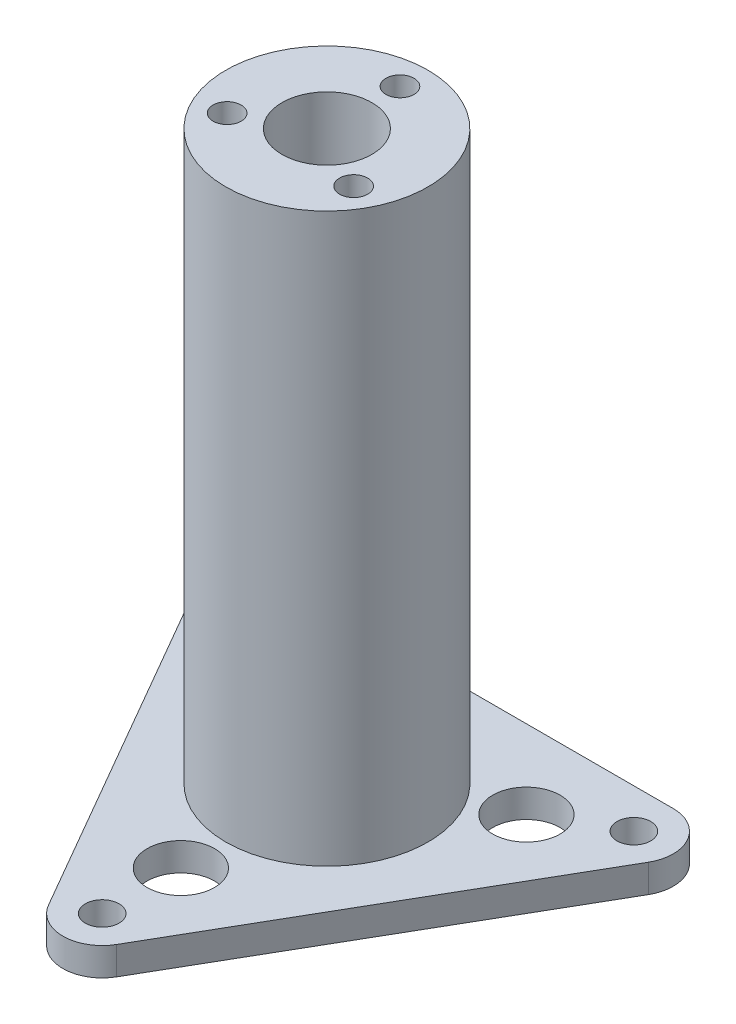
ISO-10303-21;
HEADER;
FILE_DESCRIPTION(('STEP AP214'),'2;1');
FILE_NAME('part.step','',(''),(''),'','','');
FILE_SCHEMA(('AUTOMOTIVE_DESIGN { 1 0 10303 214 1 1 1 1 }'));
ENDSEC;
DATA;
#1=APPLICATION_CONTEXT('core data for automotive mechanical design processes');
#2=APPLICATION_PROTOCOL_DEFINITION('international standard','automotive_design',2000,#1);
#3=PRODUCT_CONTEXT('',#1,'mechanical');
#4=PRODUCT('Part','Part','',(#3));
#5=PRODUCT_RELATED_PRODUCT_CATEGORY('part','',(#4));
#6=PRODUCT_DEFINITION_FORMATION('','',#4);
#7=PRODUCT_DEFINITION_CONTEXT('part definition',#1,'design');
#8=PRODUCT_DEFINITION('design','',#6,#7);
#9=PRODUCT_DEFINITION_SHAPE('','',#8);
#10=(LENGTH_UNIT() NAMED_UNIT(*) SI_UNIT(.MILLI.,.METRE.));
#11=(NAMED_UNIT(*) PLANE_ANGLE_UNIT() SI_UNIT($,.RADIAN.));
#12=(NAMED_UNIT(*) SI_UNIT($,.STERADIAN.) SOLID_ANGLE_UNIT());
#13=UNCERTAINTY_MEASURE_WITH_UNIT(LENGTH_MEASURE(1.E-05),#10,'distance_accuracy_value','');
#14=(GEOMETRIC_REPRESENTATION_CONTEXT(3) GLOBAL_UNCERTAINTY_ASSIGNED_CONTEXT((#13)) GLOBAL_UNIT_ASSIGNED_CONTEXT((#10,
#11,#12)) REPRESENTATION_CONTEXT('',''));
#15=CARTESIAN_POINT('',(0.,0.,0.));
#16=DIRECTION('',(0.,0.,1.));
#17=DIRECTION('',(1.,0.,0.));
#18=AXIS2_PLACEMENT_3D('',#15,#16,#17);
#19=CARTESIAN_POINT('',(0.,0.,0.));
#20=DIRECTION('',(0.,1.,0.));
#21=DIRECTION('',(0.,0.,1.));
#22=AXIS2_PLACEMENT_3D('',#19,#20,#21);
#23=CYLINDRICAL_SURFACE('',#22,4.00000000000001);
#24=CARTESIAN_POINT('',(0.,53.,0.));
#25=DIRECTION('',(0.,1.,0.));
#26=DIRECTION('',(0.,0.,1.));
#27=AXIS2_PLACEMENT_3D('',#24,#25,#26);
#28=CIRCLE('',#27,4.00000000000001);
#29=CARTESIAN_POINT('',(0.,53.,4.00000000000001));
#30=VERTEX_POINT('',#29);
#31=EDGE_CURVE('E126',#30,#30,#28,.T.);
#32=ORIENTED_EDGE('',*,*,#31,.T.);
#33=EDGE_LOOP('',(#32));
#34=FACE_BOUND('',#33,.T.);
#35=CARTESIAN_POINT('',(0.,40.,0.));
#36=DIRECTION('',(0.,-1.,0.));
#37=DIRECTION('',(0.,0.,-1.));
#38=AXIS2_PLACEMENT_3D('',#35,#36,#37);
#39=CIRCLE('',#38,4.00000000000001);
#40=CARTESIAN_POINT('',(0.,40.,-4.00000000000001));
#41=VERTEX_POINT('',#40);
#42=EDGE_CURVE('E257',#41,#41,#39,.F.);
#43=ORIENTED_EDGE('',*,*,#42,.F.);
#44=EDGE_LOOP('',(#43));
#45=FACE_BOUND('',#44,.T.);
#46=ADVANCED_FACE('F43',(#34,#45),#23,.F.);
#47=CARTESIAN_POINT('',(23.5,2.5,0.));
#48=DIRECTION('',(0.,1.,0.));
#49=DIRECTION('',(0.,0.,1.));
#50=AXIS2_PLACEMENT_3D('',#47,#48,#49);
#51=PLANE('',#50);
#52=CARTESIAN_POINT('',(11.2583302491977,2.5,-6.5));
#53=DIRECTION('',(0.,1.,0.));
#54=DIRECTION('',(0.,0.,1.));
#55=AXIS2_PLACEMENT_3D('',#52,#53,#54);
#56=CIRCLE('',#55,3.);
#57=CARTESIAN_POINT('',(11.2583302491977,2.5,-3.5));
#58=VERTEX_POINT('',#57);
#59=EDGE_CURVE('E210',#58,#58,#56,.T.);
#60=ORIENTED_EDGE('',*,*,#59,.F.);
#61=EDGE_LOOP('',(#60));
#62=FACE_BOUND('',#61,.T.);
#63=CARTESIAN_POINT('',(0.,2.5,13.));
#64=DIRECTION('',(0.,1.,0.));
#65=DIRECTION('',(0.,0.,1.));
#66=AXIS2_PLACEMENT_3D('',#63,#64,#65);
#67=CIRCLE('',#66,3.);
#68=CARTESIAN_POINT('',(0.,2.5,16.));
#69=VERTEX_POINT('',#68);
#70=EDGE_CURVE('E251',#69,#69,#67,.T.);
#71=ORIENTED_EDGE('',*,*,#70,.F.);
#72=EDGE_LOOP('',(#71));
#73=FACE_BOUND('',#72,.T.);
#74=CARTESIAN_POINT('',(-17.3205080756888,2.5,-10.));
#75=DIRECTION('',(0.,1.,0.));
#76=DIRECTION('',(0.,0.,1.));
#77=AXIS2_PLACEMENT_3D('',#74,#75,#76);
#78=CIRCLE('',#77,1.5);
#79=CARTESIAN_POINT('',(-17.3205080756888,2.5,-8.50000000000001));
#80=VERTEX_POINT('',#79);
#81=EDGE_CURVE('E247',#80,#80,#78,.T.);
#82=ORIENTED_EDGE('',*,*,#81,.F.);
#83=EDGE_LOOP('',(#82));
#84=FACE_BOUND('',#83,.T.);
#85=CARTESIAN_POINT('',(17.3205080756888,2.5,-10.));
#86=DIRECTION('',(0.,1.,0.));
#87=DIRECTION('',(0.,0.,1.));
#88=AXIS2_PLACEMENT_3D('',#85,#86,#87);
#89=CIRCLE('',#88,1.5);
#90=CARTESIAN_POINT('',(17.3205080756888,2.5,-8.49999999999999));
#91=VERTEX_POINT('',#90);
#92=EDGE_CURVE('E222',#91,#91,#89,.T.);
#93=ORIENTED_EDGE('',*,*,#92,.F.);
#94=EDGE_LOOP('',(#93));
#95=FACE_BOUND('',#94,.T.);
#96=CARTESIAN_POINT('',(-11.2583302491977,2.5,-6.50000000000001));
#97=DIRECTION('',(0.,1.,0.));
#98=DIRECTION('',(0.,0.,1.));
#99=AXIS2_PLACEMENT_3D('',#96,#97,#98);
#100=CIRCLE('',#99,3.);
#101=CARTESIAN_POINT('',(-11.2583302491977,2.5,-3.50000000000001));
#102=VERTEX_POINT('',#101);
#103=EDGE_CURVE('E218',#102,#102,#100,.T.);
#104=ORIENTED_EDGE('',*,*,#103,.F.);
#105=EDGE_LOOP('',(#104));
#106=FACE_BOUND('',#105,.T.);
#107=CARTESIAN_POINT('',(0.,2.5,20.));
#108=DIRECTION('',(0.,1.,0.));
#109=DIRECTION('',(0.,0.,1.));
#110=AXIS2_PLACEMENT_3D('',#107,#108,#109);
#111=CIRCLE('',#110,1.5);
#112=CARTESIAN_POINT('',(0.,2.5,21.5));
#113=VERTEX_POINT('',#112);
#114=EDGE_CURVE('E204',#113,#113,#111,.T.);
#115=ORIENTED_EDGE('',*,*,#114,.F.);
#116=EDGE_LOOP('',(#115));
#117=FACE_BOUND('',#116,.T.);
#118=CARTESIAN_POINT('',(0.,2.5,0.));
#119=DIRECTION('',(0.,-1.,0.));
#120=DIRECTION('',(0.,0.,-1.));
#121=AXIS2_PLACEMENT_3D('',#118,#119,#120);
#122=CIRCLE('',#121,9.00000000000001);
#123=CARTESIAN_POINT('',(0.,2.5,-9.00000000000001));
#124=VERTEX_POINT('',#123);
#125=EDGE_CURVE('E209',#124,#124,#122,.T.);
#126=ORIENTED_EDGE('',*,*,#125,.T.);
#127=EDGE_LOOP('',(#126));
#128=FACE_BOUND('',#127,.T.);
#129=DIRECTION('',(0.5,0.,0.866025403784439));
#130=VECTOR('',#129,1.);
#131=CARTESIAN_POINT('',(-5.81634295108992,2.5,16.9257984944671));
#132=LINE('',#131,#130);
#133=CARTESIAN_POINT('',(-20.3515969889343,2.5,-8.25000000000001));
#134=VERTEX_POINT('',#133);
#135=CARTESIAN_POINT('',(-3.03108891324553,2.5,21.75));
#136=VERTEX_POINT('',#135);
#137=EDGE_CURVE('E214',#134,#136,#132,.T.);
#138=ORIENTED_EDGE('',*,*,#137,.T.);
#139=CARTESIAN_POINT('',(0.,2.5,20.));
#140=DIRECTION('',(0.,1.,0.));
#141=DIRECTION('',(0.,0.,1.));
#142=AXIS2_PLACEMENT_3D('',#139,#140,#141);
#143=CIRCLE('',#142,3.49999999999999);
#144=CARTESIAN_POINT('',(3.03108891324552,2.5,21.75));
#145=VERTEX_POINT('',#144);
#146=EDGE_CURVE('E52',#136,#145,#143,.T.);
#147=ORIENTED_EDGE('',*,*,#146,.T.);
#148=DIRECTION('',(0.5,0.,-0.866025403784439));
#149=VECTOR('',#148,1.);
#150=CARTESIAN_POINT('',(17.5663429510899,2.5,-3.42579849446716));
#151=LINE('',#150,#149);
#152=CARTESIAN_POINT('',(20.3515969889343,2.5,-8.25));
#153=VERTEX_POINT('',#152);
#154=EDGE_CURVE('E238',#145,#153,#151,.T.);
#155=ORIENTED_EDGE('',*,*,#154,.T.);
#156=CARTESIAN_POINT('',(17.3205080756888,2.5,-9.99999999999999));
#157=DIRECTION('',(0.,1.,0.));
#158=DIRECTION('',(0.,0.,1.));
#159=AXIS2_PLACEMENT_3D('',#156,#157,#158);
#160=CIRCLE('',#159,3.49999999999999);
#161=CARTESIAN_POINT('',(17.3205080756888,2.5,-13.5));
#162=VERTEX_POINT('',#161);
#163=EDGE_CURVE('E234',#153,#162,#160,.T.);
#164=ORIENTED_EDGE('',*,*,#163,.T.);
#165=DIRECTION('',(-1.,0.,0.));
#166=VECTOR('',#165,1.);
#167=CARTESIAN_POINT('',(23.5,2.5,-13.5));
#168=LINE('',#167,#166);
#169=CARTESIAN_POINT('',(-17.3205080756888,2.5,-13.5));
#170=VERTEX_POINT('',#169);
#171=EDGE_CURVE('E230',#162,#170,#168,.T.);
#172=ORIENTED_EDGE('',*,*,#171,.T.);
#173=CARTESIAN_POINT('',(-17.3205080756888,2.5,-10.));
#174=DIRECTION('',(0.,1.,0.));
#175=DIRECTION('',(0.,0.,1.));
#176=AXIS2_PLACEMENT_3D('',#173,#174,#175);
#177=CIRCLE('',#176,3.49999999999999);
#178=EDGE_CURVE('E226',#170,#134,#177,.T.);
#179=ORIENTED_EDGE('',*,*,#178,.T.);
#180=EDGE_LOOP('',(#138,#147,#155,#164,#172,#179));
#181=FACE_BOUND('',#180,.T.);
#182=ADVANCED_FACE('F306',(#62,#73,#84,#95,#106,#117,#128,#181),#51,.T.);
#183=CARTESIAN_POINT('',(0.,0.,0.));
#184=DIRECTION('',(0.,-1.,0.));
#185=DIRECTION('',(0.,0.,-1.));
#186=AXIS2_PLACEMENT_3D('',#183,#184,#185);
#187=CYLINDRICAL_SURFACE('',#186,9.00000000000001);
#188=CARTESIAN_POINT('',(0.,53.,0.));
#189=DIRECTION('',(0.,-1.,0.));
#190=DIRECTION('',(0.,0.,-1.));
#191=AXIS2_PLACEMENT_3D('',#188,#189,#190);
#192=CIRCLE('',#191,9.00000000000001);
#193=CARTESIAN_POINT('',(0.,53.,-9.00000000000001));
#194=VERTEX_POINT('',#193);
#195=EDGE_CURVE('E205',#194,#194,#192,.T.);
#196=ORIENTED_EDGE('',*,*,#195,.T.);
#197=EDGE_LOOP('',(#196));
#198=FACE_BOUND('',#197,.T.);
#199=ORIENTED_EDGE('',*,*,#125,.F.);
#200=EDGE_LOOP('',(#199));
#201=FACE_BOUND('',#200,.T.);
#202=ADVANCED_FACE('F327',(#198,#201),#187,.T.);
#203=CARTESIAN_POINT('',(9.00000000000001,53.,0.));
#204=DIRECTION('',(0.,1.,0.));
#205=DIRECTION('',(0.,0.,1.));
#206=AXIS2_PLACEMENT_3D('',#203,#204,#205);
#207=PLANE('',#206);
#208=ORIENTED_EDGE('',*,*,#31,.F.);
#209=EDGE_LOOP('',(#208));
#210=FACE_BOUND('',#209,.T.);
#211=CARTESIAN_POINT('',(0.,53.,-6.50000000000001));
#212=DIRECTION('',(0.,1.,0.));
#213=DIRECTION('',(0.,0.,1.));
#214=AXIS2_PLACEMENT_3D('',#211,#212,#213);
#215=CIRCLE('',#214,1.24999999999999);
#216=CARTESIAN_POINT('',(0.,53.,-5.25000000000002));
#217=VERTEX_POINT('',#216);
#218=EDGE_CURVE('E118',#217,#217,#215,.T.);
#219=ORIENTED_EDGE('',*,*,#218,.F.);
#220=EDGE_LOOP('',(#219));
#221=FACE_BOUND('',#220,.T.);
#222=CARTESIAN_POINT('',(5.62916512459886,53.,3.25));
#223=DIRECTION('',(0.,1.,0.));
#224=DIRECTION('',(0.,0.,1.));
#225=AXIS2_PLACEMENT_3D('',#222,#223,#224);
#226=CIRCLE('',#225,1.24999999999999);
#227=CARTESIAN_POINT('',(5.62916512459886,53.,4.49999999999999));
#228=VERTEX_POINT('',#227);
#229=EDGE_CURVE('E117',#228,#228,#226,.T.);
#230=ORIENTED_EDGE('',*,*,#229,.F.);
#231=EDGE_LOOP('',(#230));
#232=FACE_BOUND('',#231,.T.);
#233=CARTESIAN_POINT('',(-5.62916512459886,53.,3.25));
#234=DIRECTION('',(0.,1.,0.));
#235=DIRECTION('',(0.,0.,1.));
#236=AXIS2_PLACEMENT_3D('',#233,#234,#235);
#237=CIRCLE('',#236,1.24999999999999);
#238=CARTESIAN_POINT('',(-5.62916512459886,53.,4.49999999999999));
#239=VERTEX_POINT('',#238);
#240=EDGE_CURVE('E133',#239,#239,#237,.T.);
#241=ORIENTED_EDGE('',*,*,#240,.F.);
#242=EDGE_LOOP('',(#241));
#243=FACE_BOUND('',#242,.T.);
#244=ORIENTED_EDGE('',*,*,#195,.F.);
#245=EDGE_LOOP('',(#244));
#246=FACE_BOUND('',#245,.T.);
#247=ADVANCED_FACE('F378',(#210,#221,#232,#243,#246),#207,.T.);
#248=CARTESIAN_POINT('',(0.,53.,20.));
#249=DIRECTION('',(0.,-1.,0.));
#250=DIRECTION('',(0.,0.,-1.));
#251=AXIS2_PLACEMENT_3D('',#248,#249,#250);
#252=CYLINDRICAL_SURFACE('',#251,1.5);
#253=ORIENTED_EDGE('',*,*,#114,.T.);
#254=EDGE_LOOP('',(#253));
#255=FACE_BOUND('',#254,.T.);
#256=CARTESIAN_POINT('',(0.,0.,20.));
#257=DIRECTION('',(0.,-1.,0.));
#258=DIRECTION('',(0.,0.,-1.));
#259=AXIS2_PLACEMENT_3D('',#256,#257,#258);
#260=CIRCLE('',#259,1.5);
#261=CARTESIAN_POINT('',(0.,0.,18.5));
#262=VERTEX_POINT('',#261);
#263=EDGE_CURVE('E197',#262,#262,#260,.T.);
#264=ORIENTED_EDGE('',*,*,#263,.T.);
#265=EDGE_LOOP('',(#264));
#266=FACE_BOUND('',#265,.T.);
#267=ADVANCED_FACE('F358',(#255,#266),#252,.F.);
#268=CARTESIAN_POINT('',(-11.2583302491977,53.,-6.50000000000001));
#269=DIRECTION('',(0.,-1.,0.));
#270=DIRECTION('',(0.,0.,-1.));
#271=AXIS2_PLACEMENT_3D('',#268,#269,#270);
#272=CYLINDRICAL_SURFACE('',#271,3.);
#273=ORIENTED_EDGE('',*,*,#103,.T.);
#274=EDGE_LOOP('',(#273));
#275=FACE_BOUND('',#274,.T.);
#276=CARTESIAN_POINT('',(-11.2583302491977,0.,-6.50000000000001));
#277=DIRECTION('',(0.,-1.,0.));
#278=DIRECTION('',(0.,0.,-1.));
#279=AXIS2_PLACEMENT_3D('',#276,#277,#278);
#280=CIRCLE('',#279,3.);
#281=CARTESIAN_POINT('',(-11.2583302491977,0.,-9.50000000000001));
#282=VERTEX_POINT('',#281);
#283=EDGE_CURVE('E165',#282,#282,#280,.T.);
#284=ORIENTED_EDGE('',*,*,#283,.T.);
#285=EDGE_LOOP('',(#284));
#286=FACE_BOUND('',#285,.T.);
#287=ADVANCED_FACE('F353',(#275,#286),#272,.F.);
#288=CARTESIAN_POINT('',(0.,53.,20.));
#289=DIRECTION('',(0.,-1.,0.));
#290=DIRECTION('',(0.,0.,-1.));
#291=AXIS2_PLACEMENT_3D('',#288,#289,#290);
#292=CYLINDRICAL_SURFACE('',#291,3.49999999999999);
#293=ORIENTED_EDGE('',*,*,#146,.F.);
#294=DIRECTION('',(0.,-1.,0.));
#295=VECTOR('',#294,1.);
#296=CARTESIAN_POINT('',(-3.03108891324553,53.,21.75));
#297=LINE('',#296,#295);
#298=CARTESIAN_POINT('',(-3.03108891324552,0.,21.75));
#299=VERTEX_POINT('',#298);
#300=EDGE_CURVE('E161',#136,#299,#297,.T.);
#301=ORIENTED_EDGE('',*,*,#300,.T.);
#302=CARTESIAN_POINT('',(0.,0.,20.));
#303=DIRECTION('',(0.,-1.,0.));
#304=DIRECTION('',(0.,0.,-1.));
#305=AXIS2_PLACEMENT_3D('',#302,#303,#304);
#306=CIRCLE('',#305,3.49999999999999);
#307=CARTESIAN_POINT('',(3.03108891324552,0.,21.75));
#308=VERTEX_POINT('',#307);
#309=EDGE_CURVE('E141',#308,#299,#306,.T.);
#310=ORIENTED_EDGE('',*,*,#309,.F.);
#311=DIRECTION('',(0.,-1.,0.));
#312=VECTOR('',#311,1.);
#313=CARTESIAN_POINT('',(3.03108891324552,53.,21.75));
#314=LINE('',#313,#312);
#315=EDGE_CURVE('E162',#145,#308,#314,.T.);
#316=ORIENTED_EDGE('',*,*,#315,.F.);
#317=EDGE_LOOP('',(#293,#301,#310,#316));
#318=FACE_BOUND('',#317,.T.);
#319=ADVANCED_FACE('F299',(#318),#292,.T.);
#320=CARTESIAN_POINT('',(17.3205080756888,53.,-9.99999999999999));
#321=DIRECTION('',(0.,-1.,0.));
#322=DIRECTION('',(0.,0.,-1.));
#323=AXIS2_PLACEMENT_3D('',#320,#321,#322);
#324=CYLINDRICAL_SURFACE('',#323,3.49999999999999);
#325=ORIENTED_EDGE('',*,*,#163,.F.);
#326=DIRECTION('',(0.,-1.,0.));
#327=VECTOR('',#326,1.);
#328=CARTESIAN_POINT('',(20.3515969889343,53.,-8.25));
#329=LINE('',#328,#327);
#330=CARTESIAN_POINT('',(20.3515969889343,0.,-8.25));
#331=VERTEX_POINT('',#330);
#332=EDGE_CURVE('E166',#153,#331,#329,.T.);
#333=ORIENTED_EDGE('',*,*,#332,.T.);
#334=CARTESIAN_POINT('',(17.3205080756888,0.,-9.99999999999999));
#335=DIRECTION('',(0.,-1.,0.));
#336=DIRECTION('',(0.,0.,-1.));
#337=AXIS2_PLACEMENT_3D('',#334,#335,#336);
#338=CIRCLE('',#337,3.49999999999999);
#339=CARTESIAN_POINT('',(17.3205080756888,0.,-13.5));
#340=VERTEX_POINT('',#339);
#341=EDGE_CURVE('E154',#340,#331,#338,.T.);
#342=ORIENTED_EDGE('',*,*,#341,.F.);
#343=DIRECTION('',(0.,-1.,0.));
#344=VECTOR('',#343,1.);
#345=CARTESIAN_POINT('',(17.3205080756888,53.,-13.5));
#346=LINE('',#345,#344);
#347=EDGE_CURVE('E170',#162,#340,#346,.T.);
#348=ORIENTED_EDGE('',*,*,#347,.F.);
#349=EDGE_LOOP('',(#325,#333,#342,#348));
#350=FACE_BOUND('',#349,.T.);
#351=ADVANCED_FACE('F295',(#350),#324,.T.);
#352=CARTESIAN_POINT('',(-17.3205080756888,53.,-10.));
#353=DIRECTION('',(0.,-1.,0.));
#354=DIRECTION('',(0.,0.,-1.));
#355=AXIS2_PLACEMENT_3D('',#352,#353,#354);
#356=CYLINDRICAL_SURFACE('',#355,3.49999999999999);
#357=ORIENTED_EDGE('',*,*,#178,.F.);
#358=DIRECTION('',(0.,-1.,0.));
#359=VECTOR('',#358,1.);
#360=CARTESIAN_POINT('',(-17.3205080756888,53.,-13.5));
#361=LINE('',#360,#359);
#362=CARTESIAN_POINT('',(-17.3205080756888,0.,-13.5));
#363=VERTEX_POINT('',#362);
#364=EDGE_CURVE('E173',#170,#363,#361,.T.);
#365=ORIENTED_EDGE('',*,*,#364,.T.);
#366=CARTESIAN_POINT('',(-17.3205080756888,0.,-10.));
#367=DIRECTION('',(0.,-1.,0.));
#368=DIRECTION('',(0.,0.,-1.));
#369=AXIS2_PLACEMENT_3D('',#366,#367,#368);
#370=CIRCLE('',#369,3.49999999999999);
#371=CARTESIAN_POINT('',(-20.3515969889343,0.,-8.25000000000001));
#372=VERTEX_POINT('',#371);
#373=EDGE_CURVE('E59',#372,#363,#370,.T.);
#374=ORIENTED_EDGE('',*,*,#373,.F.);
#375=DIRECTION('',(0.,-1.,0.));
#376=VECTOR('',#375,1.);
#377=CARTESIAN_POINT('',(-20.3515969889343,53.,-8.25000000000001));
#378=LINE('',#377,#376);
#379=EDGE_CURVE('E176',#134,#372,#378,.T.);
#380=ORIENTED_EDGE('',*,*,#379,.F.);
#381=EDGE_LOOP('',(#357,#365,#374,#380));
#382=FACE_BOUND('',#381,.T.);
#383=ADVANCED_FACE('F303',(#382),#356,.T.);
#384=CARTESIAN_POINT('',(20.3515969889343,53.,-8.25000000000001));
#385=DIRECTION('',(0.866025403784438,0.,0.5));
#386=DIRECTION('',(0.5,0.,-0.866025403784439));
#387=AXIS2_PLACEMENT_3D('',#384,#385,#386);
#388=PLANE('',#387);
#389=ORIENTED_EDGE('',*,*,#315,.T.);
#390=DIRECTION('',(-0.5,0.,0.866025403784439));
#391=VECTOR('',#390,1.);
#392=CARTESIAN_POINT('',(20.3515969889343,0.,-8.25000000000001));
#393=LINE('',#392,#391);
#394=EDGE_CURVE('E157',#331,#308,#393,.T.);
#395=ORIENTED_EDGE('',*,*,#394,.F.);
#396=ORIENTED_EDGE('',*,*,#332,.F.);
#397=ORIENTED_EDGE('',*,*,#154,.F.);
#398=EDGE_LOOP('',(#389,#395,#396,#397));
#399=FACE_BOUND('',#398,.T.);
#400=ADVANCED_FACE('F297',(#399),#388,.T.);
#401=CARTESIAN_POINT('',(-17.3205080756888,53.,-13.5));
#402=DIRECTION('',(0.,0.,-1.));
#403=DIRECTION('',(-1.,0.,0.));
#404=AXIS2_PLACEMENT_3D('',#401,#402,#403);
#405=PLANE('',#404);
#406=ORIENTED_EDGE('',*,*,#347,.T.);
#407=DIRECTION('',(1.,0.,0.));
#408=VECTOR('',#407,1.);
#409=CARTESIAN_POINT('',(-17.3205080756888,0.,-13.5));
#410=LINE('',#409,#408);
#411=EDGE_CURVE('E150',#363,#340,#410,.T.);
#412=ORIENTED_EDGE('',*,*,#411,.F.);
#413=ORIENTED_EDGE('',*,*,#364,.F.);
#414=ORIENTED_EDGE('',*,*,#171,.F.);
#415=EDGE_LOOP('',(#406,#412,#413,#414));
#416=FACE_BOUND('',#415,.T.);
#417=ADVANCED_FACE('F308',(#416),#405,.T.);
#418=CARTESIAN_POINT('',(-3.03108891324553,53.,21.75));
#419=DIRECTION('',(-0.866025403784439,0.,0.5));
#420=DIRECTION('',(0.5,0.,0.866025403784439));
#421=AXIS2_PLACEMENT_3D('',#418,#419,#420);
#422=PLANE('',#421);
#423=ORIENTED_EDGE('',*,*,#379,.T.);
#424=DIRECTION('',(-0.5,0.,-0.866025403784439));
#425=VECTOR('',#424,1.);
#426=CARTESIAN_POINT('',(-3.03108891324553,0.,21.75));
#427=LINE('',#426,#425);
#428=EDGE_CURVE('E144',#299,#372,#427,.T.);
#429=ORIENTED_EDGE('',*,*,#428,.F.);
#430=ORIENTED_EDGE('',*,*,#300,.F.);
#431=ORIENTED_EDGE('',*,*,#137,.F.);
#432=EDGE_LOOP('',(#423,#429,#430,#431));
#433=FACE_BOUND('',#432,.T.);
#434=ADVANCED_FACE('F302',(#433),#422,.T.);
#435=CARTESIAN_POINT('',(17.3205080756888,53.,-10.));
#436=DIRECTION('',(0.,-1.,0.));
#437=DIRECTION('',(0.,0.,-1.));
#438=AXIS2_PLACEMENT_3D('',#435,#436,#437);
#439=CYLINDRICAL_SURFACE('',#438,1.5);
#440=ORIENTED_EDGE('',*,*,#92,.T.);
#441=EDGE_LOOP('',(#440));
#442=FACE_BOUND('',#441,.T.);
#443=CARTESIAN_POINT('',(17.3205080756888,0.,-10.));
#444=DIRECTION('',(0.,-1.,0.));
#445=DIRECTION('',(0.,0.,-1.));
#446=AXIS2_PLACEMENT_3D('',#443,#444,#445);
#447=CIRCLE('',#446,1.5);
#448=CARTESIAN_POINT('',(17.3205080756888,0.,-11.5));
#449=VERTEX_POINT('',#448);
#450=EDGE_CURVE('E193',#449,#449,#447,.T.);
#451=ORIENTED_EDGE('',*,*,#450,.T.);
#452=EDGE_LOOP('',(#451));
#453=FACE_BOUND('',#452,.T.);
#454=ADVANCED_FACE('F315',(#442,#453),#439,.F.);
#455=CARTESIAN_POINT('',(-17.3205080756888,53.,-10.));
#456=DIRECTION('',(0.,-1.,0.));
#457=DIRECTION('',(0.,0.,-1.));
#458=AXIS2_PLACEMENT_3D('',#455,#456,#457);
#459=CYLINDRICAL_SURFACE('',#458,1.5);
#460=ORIENTED_EDGE('',*,*,#81,.T.);
#461=EDGE_LOOP('',(#460));
#462=FACE_BOUND('',#461,.T.);
#463=CARTESIAN_POINT('',(-17.3205080756888,0.,-10.));
#464=DIRECTION('',(0.,-1.,0.));
#465=DIRECTION('',(0.,0.,-1.));
#466=AXIS2_PLACEMENT_3D('',#463,#464,#465);
#467=CIRCLE('',#466,1.5);
#468=CARTESIAN_POINT('',(-17.3205080756888,0.,-11.5));
#469=VERTEX_POINT('',#468);
#470=EDGE_CURVE('E189',#469,#469,#467,.T.);
#471=ORIENTED_EDGE('',*,*,#470,.T.);
#472=EDGE_LOOP('',(#471));
#473=FACE_BOUND('',#472,.T.);
#474=ADVANCED_FACE('F365',(#462,#473),#459,.F.);
#475=CARTESIAN_POINT('',(0.,53.,13.));
#476=DIRECTION('',(0.,-1.,0.));
#477=DIRECTION('',(0.,0.,-1.));
#478=AXIS2_PLACEMENT_3D('',#475,#476,#477);
#479=CYLINDRICAL_SURFACE('',#478,3.);
#480=ORIENTED_EDGE('',*,*,#70,.T.);
#481=EDGE_LOOP('',(#480));
#482=FACE_BOUND('',#481,.T.);
#483=CARTESIAN_POINT('',(0.,0.,13.));
#484=DIRECTION('',(0.,-1.,0.));
#485=DIRECTION('',(0.,0.,-1.));
#486=AXIS2_PLACEMENT_3D('',#483,#484,#485);
#487=CIRCLE('',#486,3.);
#488=CARTESIAN_POINT('',(0.,0.,10.));
#489=VERTEX_POINT('',#488);
#490=EDGE_CURVE('E185',#489,#489,#487,.T.);
#491=ORIENTED_EDGE('',*,*,#490,.T.);
#492=EDGE_LOOP('',(#491));
#493=FACE_BOUND('',#492,.T.);
#494=ADVANCED_FACE('F362',(#482,#493),#479,.F.);
#495=CARTESIAN_POINT('',(11.2583302491977,53.,-6.5));
#496=DIRECTION('',(0.,-1.,0.));
#497=DIRECTION('',(0.,0.,-1.));
#498=AXIS2_PLACEMENT_3D('',#495,#496,#497);
#499=CYLINDRICAL_SURFACE('',#498,3.);
#500=ORIENTED_EDGE('',*,*,#59,.T.);
#501=EDGE_LOOP('',(#500));
#502=FACE_BOUND('',#501,.T.);
#503=CARTESIAN_POINT('',(11.2583302491977,0.,-6.5));
#504=DIRECTION('',(0.,-1.,0.));
#505=DIRECTION('',(0.,0.,-1.));
#506=AXIS2_PLACEMENT_3D('',#503,#504,#505);
#507=CIRCLE('',#506,3.);
#508=CARTESIAN_POINT('',(11.2583302491977,0.,-9.5));
#509=VERTEX_POINT('',#508);
#510=EDGE_CURVE('E184',#509,#509,#507,.T.);
#511=ORIENTED_EDGE('',*,*,#510,.T.);
#512=EDGE_LOOP('',(#511));
#513=FACE_BOUND('',#512,.T.);
#514=ADVANCED_FACE('F276',(#502,#513),#499,.F.);
#515=CARTESIAN_POINT('',(0.,0.,0.));
#516=DIRECTION('',(0.,-1.,0.));
#517=DIRECTION('',(0.,0.,-1.));
#518=AXIS2_PLACEMENT_3D('',#515,#516,#517);
#519=PLANE('',#518);
#520=CARTESIAN_POINT('',(0.,0.,0.));
#521=DIRECTION('',(0.,-1.,0.));
#522=DIRECTION('',(0.,0.,-1.));
#523=AXIS2_PLACEMENT_3D('',#520,#521,#522);
#524=CIRCLE('',#523,6.);
#525=CARTESIAN_POINT('',(0.,0.,-6.));
#526=VERTEX_POINT('',#525);
#527=EDGE_CURVE('E260',#526,#526,#524,.T.);
#528=ORIENTED_EDGE('',*,*,#527,.F.);
#529=EDGE_LOOP('',(#528));
#530=FACE_BOUND('',#529,.T.);
#531=ORIENTED_EDGE('',*,*,#510,.F.);
#532=EDGE_LOOP('',(#531));
#533=FACE_BOUND('',#532,.T.);
#534=ORIENTED_EDGE('',*,*,#490,.F.);
#535=EDGE_LOOP('',(#534));
#536=FACE_BOUND('',#535,.T.);
#537=ORIENTED_EDGE('',*,*,#470,.F.);
#538=EDGE_LOOP('',(#537));
#539=FACE_BOUND('',#538,.T.);
#540=ORIENTED_EDGE('',*,*,#450,.F.);
#541=EDGE_LOOP('',(#540));
#542=FACE_BOUND('',#541,.T.);
#543=ORIENTED_EDGE('',*,*,#283,.F.);
#544=EDGE_LOOP('',(#543));
#545=FACE_BOUND('',#544,.T.);
#546=ORIENTED_EDGE('',*,*,#263,.F.);
#547=EDGE_LOOP('',(#546));
#548=FACE_BOUND('',#547,.T.);
#549=ORIENTED_EDGE('',*,*,#341,.T.);
#550=ORIENTED_EDGE('',*,*,#394,.T.);
#551=ORIENTED_EDGE('',*,*,#309,.T.);
#552=ORIENTED_EDGE('',*,*,#428,.T.);
#553=ORIENTED_EDGE('',*,*,#373,.T.);
#554=ORIENTED_EDGE('',*,*,#411,.T.);
#555=EDGE_LOOP('',(#549,#550,#551,#552,#553,#554));
#556=FACE_BOUND('',#555,.T.);
#557=ADVANCED_FACE('F272',(#530,#533,#536,#539,#542,#545,#548,#556),#519,.T.);
#558=CARTESIAN_POINT('',(-5.62916512459886,45.5,3.25));
#559=DIRECTION('',(0.,1.,0.));
#560=DIRECTION('',(0.,0.,1.));
#561=AXIS2_PLACEMENT_3D('',#558,#559,#560);
#562=CONICAL_SURFACE('',#561,1.24999999999999,1.02974425867665);
#563=CARTESIAN_POINT('',(-5.62916512459886,44.7489242262155,3.25));
#564=VERTEX_POINT('',#563);
#565=VERTEX_LOOP('',#564);
#566=FACE_BOUND('',#565,.T.);
#567=CARTESIAN_POINT('',(-5.62916512459886,45.5,3.25));
#568=DIRECTION('',(0.,1.,0.));
#569=DIRECTION('',(0.,0.,1.));
#570=AXIS2_PLACEMENT_3D('',#567,#568,#569);
#571=CIRCLE('',#570,1.24999999999999);
#572=CARTESIAN_POINT('',(-5.62916512459886,45.5,4.49999999999999));
#573=VERTEX_POINT('',#572);
#574=EDGE_CURVE('E137',#573,#573,#571,.T.);
#575=ORIENTED_EDGE('',*,*,#574,.T.);
#576=EDGE_LOOP('',(#575));
#577=FACE_BOUND('',#576,.T.);
#578=ADVANCED_FACE('F275',(#566,#577),#562,.F.);
#579=CARTESIAN_POINT('',(-5.62916512459886,53.,3.25));
#580=DIRECTION('',(0.,1.,0.));
#581=DIRECTION('',(0.,0.,1.));
#582=AXIS2_PLACEMENT_3D('',#579,#580,#581);
#583=CYLINDRICAL_SURFACE('',#582,1.24999999999999);
#584=ORIENTED_EDGE('',*,*,#574,.F.);
#585=EDGE_LOOP('',(#584));
#586=FACE_BOUND('',#585,.T.);
#587=ORIENTED_EDGE('',*,*,#240,.T.);
#588=EDGE_LOOP('',(#587));
#589=FACE_BOUND('',#588,.T.);
#590=ADVANCED_FACE('F341',(#586,#589),#583,.F.);
#591=CARTESIAN_POINT('',(5.62916512459886,45.5,3.25));
#592=DIRECTION('',(0.,1.,0.));
#593=DIRECTION('',(0.,0.,1.));
#594=AXIS2_PLACEMENT_3D('',#591,#592,#593);
#595=CONICAL_SURFACE('',#594,1.24999999999999,1.02974425867665);
#596=CARTESIAN_POINT('',(5.62916512459886,44.7489242262155,3.25));
#597=VERTEX_POINT('',#596);
#598=VERTEX_LOOP('',#597);
#599=FACE_BOUND('',#598,.T.);
#600=CARTESIAN_POINT('',(5.62916512459886,45.5,3.25));
#601=DIRECTION('',(0.,1.,0.));
#602=DIRECTION('',(0.,0.,1.));
#603=AXIS2_PLACEMENT_3D('',#600,#601,#602);
#604=CIRCLE('',#603,1.24999999999999);
#605=CARTESIAN_POINT('',(5.62916512459886,45.5,4.49999999999999));
#606=VERTEX_POINT('',#605);
#607=EDGE_CURVE('E123',#606,#606,#604,.T.);
#608=ORIENTED_EDGE('',*,*,#607,.T.);
#609=EDGE_LOOP('',(#608));
#610=FACE_BOUND('',#609,.T.);
#611=ADVANCED_FACE('F337',(#599,#610),#595,.F.);
#612=CARTESIAN_POINT('',(5.62916512459886,53.,3.25));
#613=DIRECTION('',(0.,1.,0.));
#614=DIRECTION('',(0.,0.,1.));
#615=AXIS2_PLACEMENT_3D('',#612,#613,#614);
#616=CYLINDRICAL_SURFACE('',#615,1.24999999999999);
#617=ORIENTED_EDGE('',*,*,#607,.F.);
#618=EDGE_LOOP('',(#617));
#619=FACE_BOUND('',#618,.T.);
#620=ORIENTED_EDGE('',*,*,#229,.T.);
#621=EDGE_LOOP('',(#620));
#622=FACE_BOUND('',#621,.T.);
#623=ADVANCED_FACE('F110',(#619,#622),#616,.F.);
#624=CARTESIAN_POINT('',(0.,45.5,-6.50000000000001));
#625=DIRECTION('',(0.,1.,0.));
#626=DIRECTION('',(0.,0.,1.));
#627=AXIS2_PLACEMENT_3D('',#624,#625,#626);
#628=CONICAL_SURFACE('',#627,1.24999999999999,1.02974425867665);
#629=CARTESIAN_POINT('',(0.,44.7489242262155,-6.50000000000001));
#630=VERTEX_POINT('',#629);
#631=VERTEX_LOOP('',#630);
#632=FACE_BOUND('',#631,.T.);
#633=CARTESIAN_POINT('',(0.,45.5,-6.50000000000001));
#634=DIRECTION('',(0.,1.,0.));
#635=DIRECTION('',(0.,0.,1.));
#636=AXIS2_PLACEMENT_3D('',#633,#634,#635);
#637=CIRCLE('',#636,1.24999999999999);
#638=CARTESIAN_POINT('',(0.,45.5,-5.25000000000002));
#639=VERTEX_POINT('',#638);
#640=EDGE_CURVE('E114',#639,#639,#637,.T.);
#641=ORIENTED_EDGE('',*,*,#640,.T.);
#642=EDGE_LOOP('',(#641));
#643=FACE_BOUND('',#642,.T.);
#644=ADVANCED_FACE('F106',(#632,#643),#628,.F.);
#645=CARTESIAN_POINT('',(0.,53.,-6.50000000000001));
#646=DIRECTION('',(0.,1.,0.));
#647=DIRECTION('',(0.,0.,1.));
#648=AXIS2_PLACEMENT_3D('',#645,#646,#647);
#649=CYLINDRICAL_SURFACE('',#648,1.24999999999999);
#650=ORIENTED_EDGE('',*,*,#640,.F.);
#651=EDGE_LOOP('',(#650));
#652=FACE_BOUND('',#651,.T.);
#653=ORIENTED_EDGE('',*,*,#218,.T.);
#654=EDGE_LOOP('',(#653));
#655=FACE_BOUND('',#654,.T.);
#656=ADVANCED_FACE('F109',(#652,#655),#649,.F.);
#657=CARTESIAN_POINT('',(0.,40.,0.));
#658=DIRECTION('',(0.,-1.,0.));
#659=DIRECTION('',(0.,0.,-1.));
#660=AXIS2_PLACEMENT_3D('',#657,#658,#659);
#661=CYLINDRICAL_SURFACE('',#660,6.);
#662=CARTESIAN_POINT('',(0.,38.,0.));
#663=DIRECTION('',(0.,-1.,0.));
#664=DIRECTION('',(0.,0.,-1.));
#665=AXIS2_PLACEMENT_3D('',#662,#663,#664);
#666=CIRCLE('',#665,6.);
#667=CARTESIAN_POINT('',(0.,38.,-6.));
#668=VERTEX_POINT('',#667);
#669=EDGE_CURVE('E12',#668,#668,#666,.F.);
#670=ORIENTED_EDGE('',*,*,#669,.T.);
#671=EDGE_LOOP('',(#670));
#672=FACE_BOUND('',#671,.T.);
#673=ORIENTED_EDGE('',*,*,#527,.T.);
#674=EDGE_LOOP('',(#673));
#675=FACE_BOUND('',#674,.T.);
#676=ADVANCED_FACE('F270',(#672,#675),#661,.F.);
#677=CARTESIAN_POINT('',(0.,40.,0.));
#678=DIRECTION('',(0.,-1.,0.));
#679=DIRECTION('',(0.,0.,-1.));
#680=AXIS2_PLACEMENT_3D('',#677,#678,#679);
#681=CONICAL_SURFACE('',#680,3.99999999999997,0.785398163397452);
#682=ORIENTED_EDGE('',*,*,#669,.F.);
#683=EDGE_LOOP('',(#682));
#684=FACE_BOUND('',#683,.T.);
#685=ORIENTED_EDGE('',*,*,#42,.T.);
#686=EDGE_LOOP('',(#685));
#687=FACE_BOUND('',#686,.T.);
#688=ADVANCED_FACE('F45',(#684,#687),#681,.F.);
#689=CLOSED_SHELL('',(#46,#182,#202,#247,#267,#287,#319,#351,#383,#400,#417,#434,#454,#474,#494,
#514,#557,#578,#590,#611,#623,#644,#656,#676,#688));
#690=MANIFOLD_SOLID_BREP('B2',#689);
#691=ADVANCED_BREP_SHAPE_REPRESENTATION('',(#18,#690),#14);
#692=SHAPE_DEFINITION_REPRESENTATION(#9,#691);
ENDSEC;
END-ISO-10303-21;
